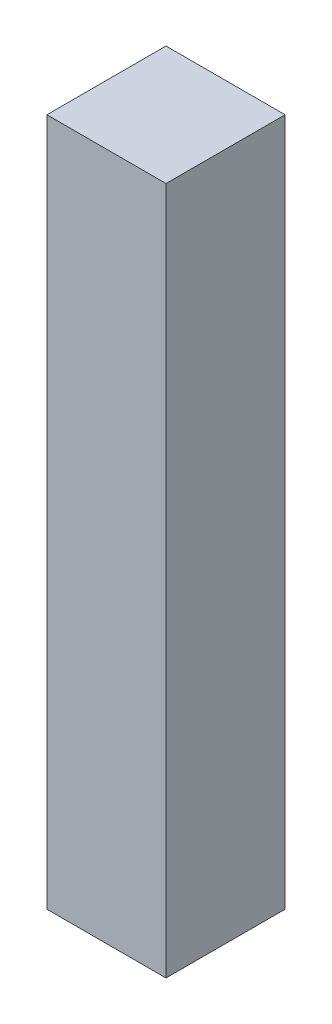
ISO-10303-21;
HEADER;
FILE_DESCRIPTION(('STEP AP214'),'2;1');
FILE_NAME('part.step','',(''),(''),'','','');
FILE_SCHEMA(('AUTOMOTIVE_DESIGN { 1 0 10303 214 1 1 1 1 }'));
ENDSEC;
DATA;
#1=APPLICATION_CONTEXT('core data for automotive mechanical design processes');
#2=APPLICATION_PROTOCOL_DEFINITION('international standard','automotive_design',2000,#1);
#3=PRODUCT_CONTEXT('',#1,'mechanical');
#4=PRODUCT('Part','Part','',(#3));
#5=PRODUCT_RELATED_PRODUCT_CATEGORY('part','',(#4));
#6=PRODUCT_DEFINITION_FORMATION('','',#4);
#7=PRODUCT_DEFINITION_CONTEXT('part definition',#1,'design');
#8=PRODUCT_DEFINITION('design','',#6,#7);
#9=PRODUCT_DEFINITION_SHAPE('','',#8);
#10=(LENGTH_UNIT() NAMED_UNIT(*) SI_UNIT(.MILLI.,.METRE.));
#11=(NAMED_UNIT(*) PLANE_ANGLE_UNIT() SI_UNIT($,.RADIAN.));
#12=(NAMED_UNIT(*) SI_UNIT($,.STERADIAN.) SOLID_ANGLE_UNIT());
#13=UNCERTAINTY_MEASURE_WITH_UNIT(LENGTH_MEASURE(1.E-05),#10,'distance_accuracy_value','');
#14=(GEOMETRIC_REPRESENTATION_CONTEXT(3) GLOBAL_UNCERTAINTY_ASSIGNED_CONTEXT((#13)) GLOBAL_UNIT_ASSIGNED_CONTEXT((#10,
#11,#12)) REPRESENTATION_CONTEXT('',''));
#15=CARTESIAN_POINT('',(0.,0.,0.));
#16=DIRECTION('',(0.,0.,1.));
#17=DIRECTION('',(1.,0.,0.));
#18=AXIS2_PLACEMENT_3D('',#15,#16,#17);
#19=CARTESIAN_POINT('',(57.15,660.4,57.15));
#20=DIRECTION('',(-1.,0.,0.));
#21=DIRECTION('',(0.,0.,1.));
#22=AXIS2_PLACEMENT_3D('',#19,#20,#21);
#23=PLANE('',#22);
#24=DIRECTION('',(0.,0.,-1.));
#25=VECTOR('',#24,1.);
#26=CARTESIAN_POINT('',(57.15,0.,57.15));
#27=LINE('',#26,#25);
#28=CARTESIAN_POINT('',(57.15,0.,57.15));
#29=VERTEX_POINT('',#28);
#30=CARTESIAN_POINT('',(57.15,0.,-57.15));
#31=VERTEX_POINT('',#30);
#32=EDGE_CURVE('E106',#29,#31,#27,.T.);
#33=ORIENTED_EDGE('',*,*,#32,.T.);
#34=DIRECTION('',(0.,-1.,0.));
#35=VECTOR('',#34,1.);
#36=CARTESIAN_POINT('',(57.15,660.4,-57.15));
#37=LINE('',#36,#35);
#38=CARTESIAN_POINT('',(57.15,660.4,-57.15));
#39=VERTEX_POINT('',#38);
#40=EDGE_CURVE('E11',#39,#31,#37,.T.);
#41=ORIENTED_EDGE('',*,*,#40,.F.);
#42=DIRECTION('',(0.,0.,-1.));
#43=VECTOR('',#42,1.);
#44=CARTESIAN_POINT('',(57.15,660.4,57.15));
#45=LINE('',#44,#43);
#46=CARTESIAN_POINT('',(57.15,660.4,57.15));
#47=VERTEX_POINT('',#46);
#48=EDGE_CURVE('E90',#47,#39,#45,.T.);
#49=ORIENTED_EDGE('',*,*,#48,.F.);
#50=DIRECTION('',(0.,-1.,0.));
#51=VECTOR('',#50,1.);
#52=CARTESIAN_POINT('',(57.15,660.4,57.15));
#53=LINE('',#52,#51);
#54=EDGE_CURVE('E102',#47,#29,#53,.T.);
#55=ORIENTED_EDGE('',*,*,#54,.T.);
#56=EDGE_LOOP('',(#33,#41,#49,#55));
#57=FACE_BOUND('',#56,.T.);
#58=ADVANCED_FACE('F38',(#57),#23,.F.);
#59=CARTESIAN_POINT('',(-57.15,660.4,-57.15));
#60=DIRECTION('',(0.,0.,1.));
#61=DIRECTION('',(1.,0.,0.));
#62=AXIS2_PLACEMENT_3D('',#59,#60,#61);
#63=PLANE('',#62);
#64=DIRECTION('',(-1.,0.,0.));
#65=VECTOR('',#64,1.);
#66=CARTESIAN_POINT('',(-57.15,0.,-57.15));
#67=LINE('',#66,#65);
#68=CARTESIAN_POINT('',(-57.15,0.,-57.15));
#69=VERTEX_POINT('',#68);
#70=EDGE_CURVE('E95',#31,#69,#67,.T.);
#71=ORIENTED_EDGE('',*,*,#70,.T.);
#72=DIRECTION('',(0.,-1.,0.));
#73=VECTOR('',#72,1.);
#74=CARTESIAN_POINT('',(-57.15,660.4,-57.15));
#75=LINE('',#74,#73);
#76=CARTESIAN_POINT('',(-57.15,660.4,-57.15));
#77=VERTEX_POINT('',#76);
#78=EDGE_CURVE('E47',#77,#69,#75,.T.);
#79=ORIENTED_EDGE('',*,*,#78,.F.);
#80=DIRECTION('',(-1.,0.,0.));
#81=VECTOR('',#80,1.);
#82=CARTESIAN_POINT('',(-57.15,660.4,-57.15));
#83=LINE('',#82,#81);
#84=EDGE_CURVE('E85',#39,#77,#83,.T.);
#85=ORIENTED_EDGE('',*,*,#84,.F.);
#86=ORIENTED_EDGE('',*,*,#40,.T.);
#87=EDGE_LOOP('',(#71,#79,#85,#86));
#88=FACE_BOUND('',#87,.T.);
#89=ADVANCED_FACE('F94',(#88),#63,.F.);
#90=CARTESIAN_POINT('',(-57.15,660.4,57.15));
#91=DIRECTION('',(1.,0.,0.));
#92=DIRECTION('',(0.,0.,-1.));
#93=AXIS2_PLACEMENT_3D('',#90,#91,#92);
#94=PLANE('',#93);
#95=DIRECTION('',(0.,0.,1.));
#96=VECTOR('',#95,1.);
#97=CARTESIAN_POINT('',(-57.15,0.,57.15));
#98=LINE('',#97,#96);
#99=CARTESIAN_POINT('',(-57.15,0.,57.15));
#100=VERTEX_POINT('',#99);
#101=EDGE_CURVE('E72',#69,#100,#98,.T.);
#102=ORIENTED_EDGE('',*,*,#101,.T.);
#103=DIRECTION('',(0.,-1.,0.));
#104=VECTOR('',#103,1.);
#105=CARTESIAN_POINT('',(-57.15,660.4,57.15));
#106=LINE('',#105,#104);
#107=CARTESIAN_POINT('',(-57.15,660.4,57.15));
#108=VERTEX_POINT('',#107);
#109=EDGE_CURVE('E97',#108,#100,#106,.T.);
#110=ORIENTED_EDGE('',*,*,#109,.F.);
#111=DIRECTION('',(0.,0.,1.));
#112=VECTOR('',#111,1.);
#113=CARTESIAN_POINT('',(-57.15,660.4,57.15));
#114=LINE('',#113,#112);
#115=EDGE_CURVE('E88',#77,#108,#114,.T.);
#116=ORIENTED_EDGE('',*,*,#115,.F.);
#117=ORIENTED_EDGE('',*,*,#78,.T.);
#118=EDGE_LOOP('',(#102,#110,#116,#117));
#119=FACE_BOUND('',#118,.T.);
#120=ADVANCED_FACE('F98',(#119),#94,.F.);
#121=CARTESIAN_POINT('',(-57.15,660.4,57.15));
#122=DIRECTION('',(0.,0.,-1.));
#123=DIRECTION('',(-1.,0.,0.));
#124=AXIS2_PLACEMENT_3D('',#121,#122,#123);
#125=PLANE('',#124);
#126=DIRECTION('',(1.,0.,0.));
#127=VECTOR('',#126,1.);
#128=CARTESIAN_POINT('',(-57.15,0.,57.15));
#129=LINE('',#128,#127);
#130=EDGE_CURVE('E78',#100,#29,#129,.T.);
#131=ORIENTED_EDGE('',*,*,#130,.T.);
#132=ORIENTED_EDGE('',*,*,#54,.F.);
#133=DIRECTION('',(1.,0.,0.));
#134=VECTOR('',#133,1.);
#135=CARTESIAN_POINT('',(-57.15,660.4,57.15));
#136=LINE('',#135,#134);
#137=EDGE_CURVE('E55',#108,#47,#136,.T.);
#138=ORIENTED_EDGE('',*,*,#137,.F.);
#139=ORIENTED_EDGE('',*,*,#109,.T.);
#140=EDGE_LOOP('',(#131,#132,#138,#139));
#141=FACE_BOUND('',#140,.T.);
#142=ADVANCED_FACE('F120',(#141),#125,.F.);
#143=CARTESIAN_POINT('',(0.,660.4,0.));
#144=DIRECTION('',(0.,-1.,0.));
#145=DIRECTION('',(0.,0.,-1.));
#146=AXIS2_PLACEMENT_3D('',#143,#144,#145);
#147=PLANE('',#146);
#148=ORIENTED_EDGE('',*,*,#48,.T.);
#149=ORIENTED_EDGE('',*,*,#84,.T.);
#150=ORIENTED_EDGE('',*,*,#115,.T.);
#151=ORIENTED_EDGE('',*,*,#137,.T.);
#152=EDGE_LOOP('',(#148,#149,#150,#151));
#153=FACE_BOUND('',#152,.T.);
#154=ADVANCED_FACE('F86',(#153),#147,.F.);
#155=CARTESIAN_POINT('',(0.,0.,0.));
#156=DIRECTION('',(0.,-1.,0.));
#157=DIRECTION('',(0.,0.,-1.));
#158=AXIS2_PLACEMENT_3D('',#155,#156,#157);
#159=PLANE('',#158);
#160=CARTESIAN_POINT('',(0.,0.,0.));
#161=DIRECTION('',(0.,1.,0.));
#162=DIRECTION('',(0.,0.,1.));
#163=AXIS2_PLACEMENT_3D('',#160,#161,#162);
#164=CIRCLE('',#163,3.96875);
#165=CARTESIAN_POINT('',(0.,0.,3.96875));
#166=VERTEX_POINT('',#165);
#167=EDGE_CURVE('E127',#166,#166,#164,.T.);
#168=ORIENTED_EDGE('',*,*,#167,.T.);
#169=EDGE_LOOP('',(#168));
#170=FACE_BOUND('',#169,.T.);
#171=ORIENTED_EDGE('',*,*,#32,.F.);
#172=ORIENTED_EDGE('',*,*,#130,.F.);
#173=ORIENTED_EDGE('',*,*,#101,.F.);
#174=ORIENTED_EDGE('',*,*,#70,.F.);
#175=EDGE_LOOP('',(#171,#172,#173,#174));
#176=FACE_BOUND('',#175,.T.);
#177=ADVANCED_FACE('F123',(#170,#176),#159,.T.);
#178=CARTESIAN_POINT('',(0.,25.4,0.));
#179=DIRECTION('',(0.,-1.,0.));
#180=DIRECTION('',(0.,0.,-1.));
#181=AXIS2_PLACEMENT_3D('',#178,#179,#180);
#182=CYLINDRICAL_SURFACE('',#181,3.96875);
#183=CARTESIAN_POINT('',(0.,25.4,0.));
#184=DIRECTION('',(0.,1.,0.));
#185=DIRECTION('',(0.,0.,1.));
#186=AXIS2_PLACEMENT_3D('',#183,#184,#185);
#187=CIRCLE('',#186,3.96875);
#188=CARTESIAN_POINT('',(0.,25.4,3.96875));
#189=VERTEX_POINT('',#188);
#190=EDGE_CURVE('E110',#189,#189,#187,.T.);
#191=ORIENTED_EDGE('',*,*,#190,.T.);
#192=EDGE_LOOP('',(#191));
#193=FACE_BOUND('',#192,.T.);
#194=ORIENTED_EDGE('',*,*,#167,.F.);
#195=EDGE_LOOP('',(#194));
#196=FACE_BOUND('',#195,.T.);
#197=ADVANCED_FACE('F135',(#193,#196),#182,.F.);
#198=CARTESIAN_POINT('',(0.,25.4,0.));
#199=DIRECTION('',(0.,1.,0.));
#200=DIRECTION('',(0.,0.,1.));
#201=AXIS2_PLACEMENT_3D('',#198,#199,#200);
#202=PLANE('',#201);
#203=ORIENTED_EDGE('',*,*,#190,.F.);
#204=EDGE_LOOP('',(#203));
#205=FACE_BOUND('',#204,.T.);
#206=ADVANCED_FACE('F138',(#205),#202,.F.);
#207=CLOSED_SHELL('',(#58,#89,#120,#142,#154,#177,#197,#206));
#208=MANIFOLD_SOLID_BREP('B2',#207);
#209=ADVANCED_BREP_SHAPE_REPRESENTATION('',(#18,#208),#14);
#210=SHAPE_DEFINITION_REPRESENTATION(#9,#209);
ENDSEC;
END-ISO-10303-21;
